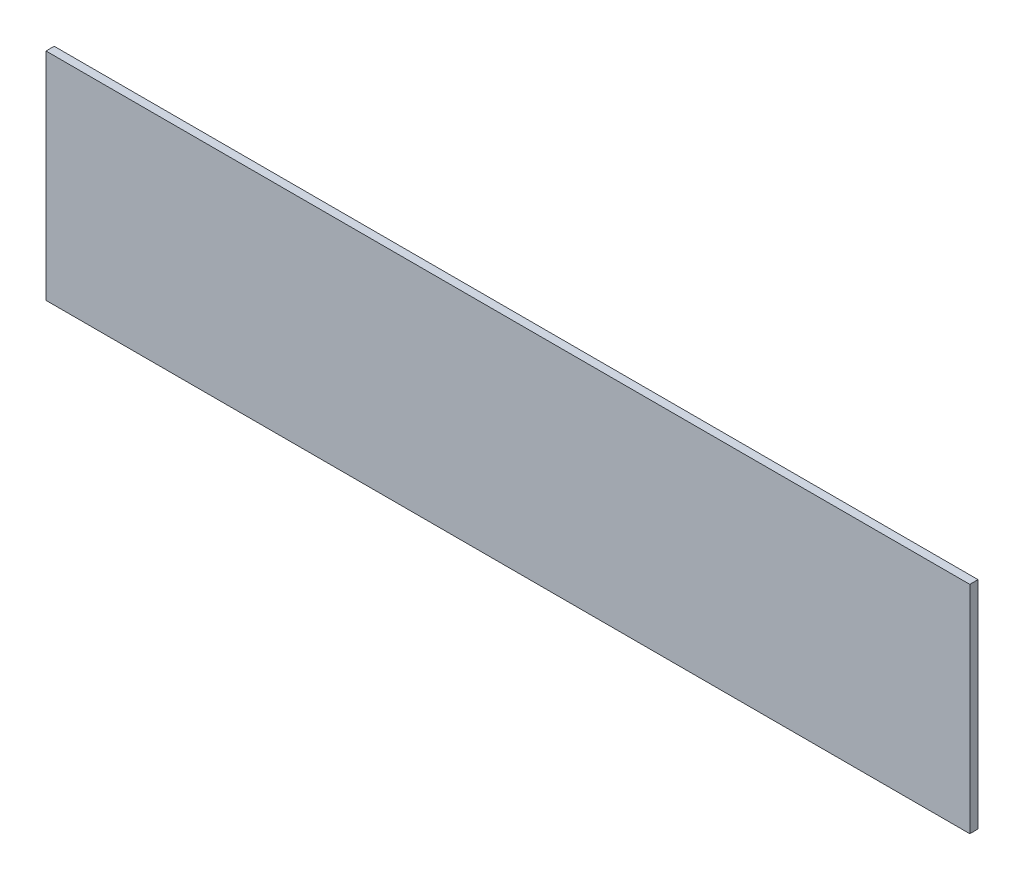
ISO-10303-21;
HEADER;
FILE_DESCRIPTION(('STEP AP214'),'2;1');
FILE_NAME('part.step','',(''),(''),'','','');
FILE_SCHEMA(('AUTOMOTIVE_DESIGN { 1 0 10303 214 1 1 1 1 }'));
ENDSEC;
DATA;
#1=APPLICATION_CONTEXT('core data for automotive mechanical design processes');
#2=APPLICATION_PROTOCOL_DEFINITION('international standard','automotive_design',2000,#1);
#3=PRODUCT_CONTEXT('',#1,'mechanical');
#4=PRODUCT('Part','Part','',(#3));
#5=PRODUCT_RELATED_PRODUCT_CATEGORY('part','',(#4));
#6=PRODUCT_DEFINITION_FORMATION('','',#4);
#7=PRODUCT_DEFINITION_CONTEXT('part definition',#1,'design');
#8=PRODUCT_DEFINITION('design','',#6,#7);
#9=PRODUCT_DEFINITION_SHAPE('','',#8);
#10=(LENGTH_UNIT() NAMED_UNIT(*) SI_UNIT(.MILLI.,.METRE.));
#11=(NAMED_UNIT(*) PLANE_ANGLE_UNIT() SI_UNIT($,.RADIAN.));
#12=(NAMED_UNIT(*) SI_UNIT($,.STERADIAN.) SOLID_ANGLE_UNIT());
#13=UNCERTAINTY_MEASURE_WITH_UNIT(LENGTH_MEASURE(1.E-05),#10,'distance_accuracy_value','');
#14=(GEOMETRIC_REPRESENTATION_CONTEXT(3) GLOBAL_UNCERTAINTY_ASSIGNED_CONTEXT((#13)) GLOBAL_UNIT_ASSIGNED_CONTEXT((#10,
#11,#12)) REPRESENTATION_CONTEXT('',''));
#15=CARTESIAN_POINT('',(0.,0.,0.));
#16=DIRECTION('',(0.,0.,1.));
#17=DIRECTION('',(1.,0.,0.));
#18=AXIS2_PLACEMENT_3D('',#15,#16,#17);
#19=CARTESIAN_POINT('',(178.77499995,41.8,3.175));
#20=DIRECTION('',(-1.,0.,0.));
#21=DIRECTION('',(0.,0.,1.));
#22=AXIS2_PLACEMENT_3D('',#19,#20,#21);
#23=PLANE('',#22);
#24=DIRECTION('',(0.,1.,0.));
#25=VECTOR('',#24,1.);
#26=CARTESIAN_POINT('',(178.77499995,41.8,0.));
#27=LINE('',#26,#25);
#28=CARTESIAN_POINT('',(178.77499995,-41.8,0.));
#29=VERTEX_POINT('',#28);
#30=CARTESIAN_POINT('',(178.77499995,41.8,0.));
#31=VERTEX_POINT('',#30);
#32=EDGE_CURVE('E100',#29,#31,#27,.T.);
#33=ORIENTED_EDGE('',*,*,#32,.T.);
#34=DIRECTION('',(0.,0.,-1.));
#35=VECTOR('',#34,1.);
#36=CARTESIAN_POINT('',(178.77499995,41.8,3.175));
#37=LINE('',#36,#35);
#38=CARTESIAN_POINT('',(178.77499995,41.8,3.175));
#39=VERTEX_POINT('',#38);
#40=EDGE_CURVE('E11',#39,#31,#37,.T.);
#41=ORIENTED_EDGE('',*,*,#40,.F.);
#42=DIRECTION('',(0.,1.,0.));
#43=VECTOR('',#42,1.);
#44=CARTESIAN_POINT('',(178.77499995,41.8,3.175));
#45=LINE('',#44,#43);
#46=CARTESIAN_POINT('',(178.77499995,-41.8,3.175));
#47=VERTEX_POINT('',#46);
#48=EDGE_CURVE('E88',#47,#39,#45,.T.);
#49=ORIENTED_EDGE('',*,*,#48,.F.);
#50=DIRECTION('',(0.,0.,-1.));
#51=VECTOR('',#50,1.);
#52=CARTESIAN_POINT('',(178.77499995,-41.8,3.175));
#53=LINE('',#52,#51);
#54=EDGE_CURVE('E96',#47,#29,#53,.T.);
#55=ORIENTED_EDGE('',*,*,#54,.T.);
#56=EDGE_LOOP('',(#33,#41,#49,#55));
#57=FACE_BOUND('',#56,.T.);
#58=ADVANCED_FACE('F37',(#57),#23,.F.);
#59=CARTESIAN_POINT('',(-178.77499995,41.8,3.175));
#60=DIRECTION('',(0.,-1.,0.));
#61=DIRECTION('',(0.,0.,-1.));
#62=AXIS2_PLACEMENT_3D('',#59,#60,#61);
#63=PLANE('',#62);
#64=DIRECTION('',(-1.,0.,0.));
#65=VECTOR('',#64,1.);
#66=CARTESIAN_POINT('',(-178.77499995,41.8,0.));
#67=LINE('',#66,#65);
#68=CARTESIAN_POINT('',(-178.77499995,41.8,0.));
#69=VERTEX_POINT('',#68);
#70=EDGE_CURVE('E92',#31,#69,#67,.T.);
#71=ORIENTED_EDGE('',*,*,#70,.T.);
#72=DIRECTION('',(0.,0.,-1.));
#73=VECTOR('',#72,1.);
#74=CARTESIAN_POINT('',(-178.77499995,41.8,3.175));
#75=LINE('',#74,#73);
#76=CARTESIAN_POINT('',(-178.77499995,41.8,3.175));
#77=VERTEX_POINT('',#76);
#78=EDGE_CURVE('E45',#77,#69,#75,.T.);
#79=ORIENTED_EDGE('',*,*,#78,.F.);
#80=DIRECTION('',(-1.,0.,0.));
#81=VECTOR('',#80,1.);
#82=CARTESIAN_POINT('',(-178.77499995,41.8,3.175));
#83=LINE('',#82,#81);
#84=EDGE_CURVE('E83',#39,#77,#83,.T.);
#85=ORIENTED_EDGE('',*,*,#84,.F.);
#86=ORIENTED_EDGE('',*,*,#40,.T.);
#87=EDGE_LOOP('',(#71,#79,#85,#86));
#88=FACE_BOUND('',#87,.T.);
#89=ADVANCED_FACE('F91',(#88),#63,.F.);
#90=CARTESIAN_POINT('',(-178.77499995,41.8,3.175));
#91=DIRECTION('',(1.,0.,0.));
#92=DIRECTION('',(0.,0.,-1.));
#93=AXIS2_PLACEMENT_3D('',#90,#91,#92);
#94=PLANE('',#93);
#95=DIRECTION('',(0.,-1.,0.));
#96=VECTOR('',#95,1.);
#97=CARTESIAN_POINT('',(-178.77499995,41.8,0.));
#98=LINE('',#97,#96);
#99=CARTESIAN_POINT('',(-178.77499995,-41.8,0.));
#100=VERTEX_POINT('',#99);
#101=EDGE_CURVE('E70',#69,#100,#98,.T.);
#102=ORIENTED_EDGE('',*,*,#101,.T.);
#103=DIRECTION('',(0.,0.,-1.));
#104=VECTOR('',#103,1.);
#105=CARTESIAN_POINT('',(-178.77499995,-41.8,3.175));
#106=LINE('',#105,#104);
#107=CARTESIAN_POINT('',(-178.77499995,-41.8,3.175));
#108=VERTEX_POINT('',#107);
#109=EDGE_CURVE('E93',#108,#100,#106,.T.);
#110=ORIENTED_EDGE('',*,*,#109,.F.);
#111=DIRECTION('',(0.,-1.,0.));
#112=VECTOR('',#111,1.);
#113=CARTESIAN_POINT('',(-178.77499995,41.8,3.175));
#114=LINE('',#113,#112);
#115=EDGE_CURVE('E86',#77,#108,#114,.T.);
#116=ORIENTED_EDGE('',*,*,#115,.F.);
#117=ORIENTED_EDGE('',*,*,#78,.T.);
#118=EDGE_LOOP('',(#102,#110,#116,#117));
#119=FACE_BOUND('',#118,.T.);
#120=ADVANCED_FACE('F94',(#119),#94,.F.);
#121=CARTESIAN_POINT('',(-178.77499995,-41.8,3.175));
#122=DIRECTION('',(0.,1.,0.));
#123=DIRECTION('',(0.,0.,1.));
#124=AXIS2_PLACEMENT_3D('',#121,#122,#123);
#125=PLANE('',#124);
#126=DIRECTION('',(1.,0.,0.));
#127=VECTOR('',#126,1.);
#128=CARTESIAN_POINT('',(-178.77499995,-41.8,0.));
#129=LINE('',#128,#127);
#130=EDGE_CURVE('E76',#100,#29,#129,.T.);
#131=ORIENTED_EDGE('',*,*,#130,.T.);
#132=ORIENTED_EDGE('',*,*,#54,.F.);
#133=DIRECTION('',(1.,0.,0.));
#134=VECTOR('',#133,1.);
#135=CARTESIAN_POINT('',(-178.77499995,-41.8,3.175));
#136=LINE('',#135,#134);
#137=EDGE_CURVE('E53',#108,#47,#136,.T.);
#138=ORIENTED_EDGE('',*,*,#137,.F.);
#139=ORIENTED_EDGE('',*,*,#109,.T.);
#140=EDGE_LOOP('',(#131,#132,#138,#139));
#141=FACE_BOUND('',#140,.T.);
#142=ADVANCED_FACE('F107',(#141),#125,.F.);
#143=CARTESIAN_POINT('',(0.,0.,3.175));
#144=DIRECTION('',(0.,0.,1.));
#145=DIRECTION('',(1.,0.,0.));
#146=AXIS2_PLACEMENT_3D('',#143,#144,#145);
#147=PLANE('',#146);
#148=ORIENTED_EDGE('',*,*,#48,.T.);
#149=ORIENTED_EDGE('',*,*,#84,.T.);
#150=ORIENTED_EDGE('',*,*,#115,.T.);
#151=ORIENTED_EDGE('',*,*,#137,.T.);
#152=EDGE_LOOP('',(#148,#149,#150,#151));
#153=FACE_BOUND('',#152,.T.);
#154=ADVANCED_FACE('F84',(#153),#147,.T.);
#155=CARTESIAN_POINT('',(0.,0.,0.));
#156=DIRECTION('',(0.,0.,1.));
#157=DIRECTION('',(1.,0.,0.));
#158=AXIS2_PLACEMENT_3D('',#155,#156,#157);
#159=PLANE('',#158);
#160=ORIENTED_EDGE('',*,*,#32,.F.);
#161=ORIENTED_EDGE('',*,*,#130,.F.);
#162=ORIENTED_EDGE('',*,*,#101,.F.);
#163=ORIENTED_EDGE('',*,*,#70,.F.);
#164=EDGE_LOOP('',(#160,#161,#162,#163));
#165=FACE_BOUND('',#164,.T.);
#166=ADVANCED_FACE('F110',(#165),#159,.F.);
#167=CLOSED_SHELL('',(#58,#89,#120,#142,#154,#166));
#168=MANIFOLD_SOLID_BREP('B2',#167);
#169=ADVANCED_BREP_SHAPE_REPRESENTATION('',(#18,#168),#14);
#170=SHAPE_DEFINITION_REPRESENTATION(#9,#169);
ENDSEC;
END-ISO-10303-21;
